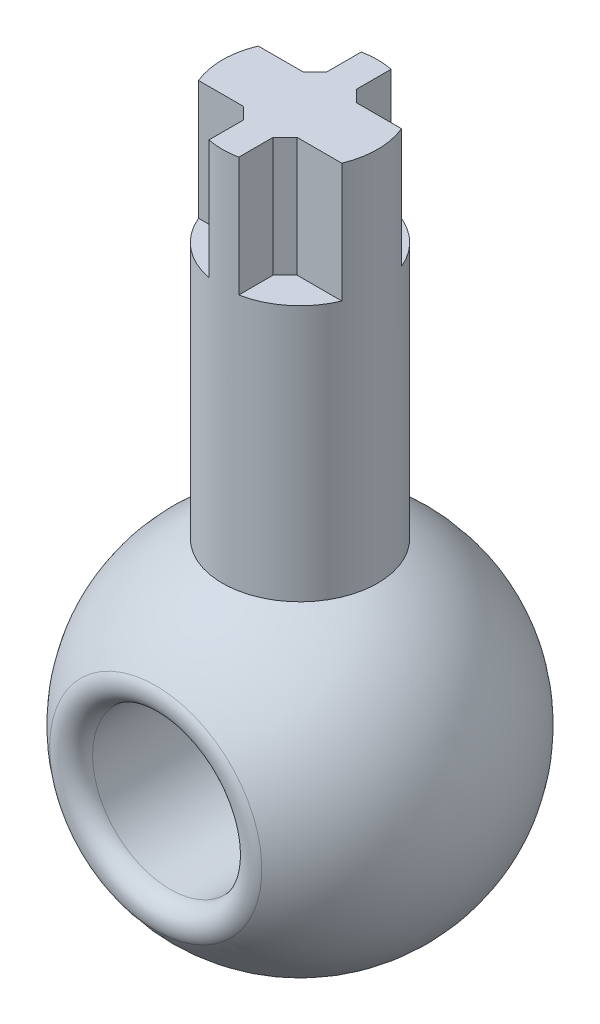
ISO-10303-21;
HEADER;
FILE_DESCRIPTION(('STEP AP214'),'2;1');
FILE_NAME('part.step','',(''),(''),'','','');
FILE_SCHEMA(('AUTOMOTIVE_DESIGN { 1 0 10303 214 1 1 1 1 }'));
ENDSEC;
DATA;
#1=APPLICATION_CONTEXT('core data for automotive mechanical design processes');
#2=APPLICATION_PROTOCOL_DEFINITION('international standard','automotive_design',2000,#1);
#3=PRODUCT_CONTEXT('',#1,'mechanical');
#4=PRODUCT('Part','Part','',(#3));
#5=PRODUCT_RELATED_PRODUCT_CATEGORY('part','',(#4));
#6=PRODUCT_DEFINITION_FORMATION('','',#4);
#7=PRODUCT_DEFINITION_CONTEXT('part definition',#1,'design');
#8=PRODUCT_DEFINITION('design','',#6,#7);
#9=PRODUCT_DEFINITION_SHAPE('','',#8);
#10=(LENGTH_UNIT() NAMED_UNIT(*) SI_UNIT(.MILLI.,.METRE.));
#11=(NAMED_UNIT(*) PLANE_ANGLE_UNIT() SI_UNIT($,.RADIAN.));
#12=(NAMED_UNIT(*) SI_UNIT($,.STERADIAN.) SOLID_ANGLE_UNIT());
#13=UNCERTAINTY_MEASURE_WITH_UNIT(LENGTH_MEASURE(1.E-05),#10,'distance_accuracy_value','');
#14=(GEOMETRIC_REPRESENTATION_CONTEXT(3) GLOBAL_UNCERTAINTY_ASSIGNED_CONTEXT((#13)) GLOBAL_UNIT_ASSIGNED_CONTEXT((#10,
#11,#12)) REPRESENTATION_CONTEXT('',''));
#15=CARTESIAN_POINT('',(0.,0.,0.));
#16=DIRECTION('',(0.,0.,1.));
#17=DIRECTION('',(1.,0.,0.));
#18=AXIS2_PLACEMENT_3D('',#15,#16,#17);
#19=CARTESIAN_POINT('',(0.,0.,0.));
#20=DIRECTION('',(-1.,0.,0.));
#21=DIRECTION('',(0.,1.,0.));
#22=AXIS2_PLACEMENT_3D('',#19,#20,#21);
#23=SPHERICAL_SURFACE('',#22,15.);
#24=CARTESIAN_POINT('',(0.,0.,12.082535094962));
#25=DIRECTION('',(0.,0.,-1.));
#26=DIRECTION('',(-1.,0.,0.));
#27=AXIS2_PLACEMENT_3D('',#24,#25,#26);
#28=CIRCLE('',#27,8.88888888888889);
#29=CARTESIAN_POINT('',(-8.88888888888889,0.,12.082535094962));
#30=VERTEX_POINT('',#29);
#31=EDGE_CURVE('E277',#30,#30,#28,.T.);
#32=ORIENTED_EDGE('',*,*,#31,.T.);
#33=EDGE_LOOP('',(#32));
#34=FACE_BOUND('',#33,.T.);
#35=CARTESIAN_POINT('',(0.,0.,-12.082535094962));
#36=DIRECTION('',(0.,0.,1.));
#37=DIRECTION('',(1.,0.,0.));
#38=AXIS2_PLACEMENT_3D('',#35,#36,#37);
#39=CIRCLE('',#38,8.88888888888889);
#40=CARTESIAN_POINT('',(8.88888888888889,0.,-12.082535094962));
#41=VERTEX_POINT('',#40);
#42=EDGE_CURVE('E274',#41,#41,#39,.T.);
#43=ORIENTED_EDGE('',*,*,#42,.T.);
#44=EDGE_LOOP('',(#43));
#45=FACE_BOUND('',#44,.T.);
#46=CARTESIAN_POINT('',(0.,13.5185058345958,0.));
#47=DIRECTION('',(0.,-1.,0.));
#48=DIRECTION('',(0.,0.,-1.));
#49=AXIS2_PLACEMENT_3D('',#46,#47,#48);
#50=CIRCLE('',#49,6.5);
#51=CARTESIAN_POINT('',(0.,13.5185058345958,-6.5));
#52=VERTEX_POINT('',#51);
#53=EDGE_CURVE('E236',#52,#52,#50,.F.);
#54=ORIENTED_EDGE('',*,*,#53,.F.);
#55=EDGE_LOOP('',(#54));
#56=FACE_BOUND('',#55,.T.);
#57=ADVANCED_FACE('F38',(#34,#45,#56),#23,.T.);
#58=CARTESIAN_POINT('',(0.,45.,0.));
#59=DIRECTION('',(0.,-1.,0.));
#60=DIRECTION('',(0.,0.,-1.));
#61=AXIS2_PLACEMENT_3D('',#58,#59,#60);
#62=CYLINDRICAL_SURFACE('',#61,6.5);
#63=CARTESIAN_POINT('',(0.,35.,0.));
#64=DIRECTION('',(0.,1.,0.));
#65=DIRECTION('',(0.,0.,1.));
#66=AXIS2_PLACEMENT_3D('',#63,#64,#65);
#67=CIRCLE('',#66,6.5);
#68=CARTESIAN_POINT('',(-6.,35.,2.5));
#69=VERTEX_POINT('',#68);
#70=CARTESIAN_POINT('',(-1.25,35.,6.37867541108654));
#71=VERTEX_POINT('',#70);
#72=EDGE_CURVE('E157',#69,#71,#67,.T.);
#73=ORIENTED_EDGE('',*,*,#72,.F.);
#74=DIRECTION('',(0.,1.,0.));
#75=VECTOR('',#74,1.);
#76=CARTESIAN_POINT('',(-6.,35.,2.5));
#77=LINE('',#76,#75);
#78=CARTESIAN_POINT('',(-6.,45.,2.5));
#79=VERTEX_POINT('',#78);
#80=EDGE_CURVE('E173',#69,#79,#77,.T.);
#81=ORIENTED_EDGE('',*,*,#80,.T.);
#82=CARTESIAN_POINT('',(0.,45.,0.));
#83=DIRECTION('',(0.,1.,0.));
#84=DIRECTION('',(0.,0.,1.));
#85=AXIS2_PLACEMENT_3D('',#82,#83,#84);
#86=CIRCLE('',#85,6.5);
#87=CARTESIAN_POINT('',(-6.,45.,-2.5));
#88=VERTEX_POINT('',#87);
#89=EDGE_CURVE('E233',#88,#79,#86,.T.);
#90=ORIENTED_EDGE('',*,*,#89,.F.);
#91=DIRECTION('',(0.,1.,0.));
#92=VECTOR('',#91,1.);
#93=CARTESIAN_POINT('',(-6.,35.,-2.5));
#94=LINE('',#93,#92);
#95=CARTESIAN_POINT('',(-6.,35.,-2.5));
#96=VERTEX_POINT('',#95);
#97=EDGE_CURVE('E224',#96,#88,#94,.T.);
#98=ORIENTED_EDGE('',*,*,#97,.F.);
#99=CARTESIAN_POINT('',(0.,35.,0.));
#100=DIRECTION('',(0.,1.,0.));
#101=DIRECTION('',(0.,0.,1.));
#102=AXIS2_PLACEMENT_3D('',#99,#100,#101);
#103=CIRCLE('',#102,6.5);
#104=CARTESIAN_POINT('',(-1.25,35.,-6.37867541108654));
#105=VERTEX_POINT('',#104);
#106=EDGE_CURVE('E215',#105,#96,#103,.T.);
#107=ORIENTED_EDGE('',*,*,#106,.F.);
#108=DIRECTION('',(0.,1.,0.));
#109=VECTOR('',#108,1.);
#110=CARTESIAN_POINT('',(-1.25,35.,-6.37867541108654));
#111=LINE('',#110,#109);
#112=CARTESIAN_POINT('',(-1.25,45.,-6.37867541108654));
#113=VERTEX_POINT('',#112);
#114=EDGE_CURVE('E228',#105,#113,#111,.T.);
#115=ORIENTED_EDGE('',*,*,#114,.T.);
#116=CARTESIAN_POINT('',(1.25,45.,-6.37867541108654));
#117=VERTEX_POINT('',#116);
#118=EDGE_CURVE('E231',#117,#113,#86,.T.);
#119=ORIENTED_EDGE('',*,*,#118,.F.);
#120=DIRECTION('',(0.,1.,0.));
#121=VECTOR('',#120,1.);
#122=CARTESIAN_POINT('',(1.25,35.,-6.37867541108654));
#123=LINE('',#122,#121);
#124=CARTESIAN_POINT('',(1.25,35.,-6.37867541108654));
#125=VERTEX_POINT('',#124);
#126=EDGE_CURVE('E189',#125,#117,#123,.T.);
#127=ORIENTED_EDGE('',*,*,#126,.F.);
#128=CARTESIAN_POINT('',(0.,35.,0.));
#129=DIRECTION('',(0.,1.,0.));
#130=DIRECTION('',(0.,0.,1.));
#131=AXIS2_PLACEMENT_3D('',#128,#129,#130);
#132=CIRCLE('',#131,6.5);
#133=CARTESIAN_POINT('',(6.,35.,-2.5));
#134=VERTEX_POINT('',#133);
#135=EDGE_CURVE('E180',#134,#125,#132,.T.);
#136=ORIENTED_EDGE('',*,*,#135,.F.);
#137=DIRECTION('',(0.,1.,0.));
#138=VECTOR('',#137,1.);
#139=CARTESIAN_POINT('',(6.,35.,-2.5));
#140=LINE('',#139,#138);
#141=CARTESIAN_POINT('',(6.,45.,-2.5));
#142=VERTEX_POINT('',#141);
#143=EDGE_CURVE('E193',#134,#142,#140,.T.);
#144=ORIENTED_EDGE('',*,*,#143,.T.);
#145=CARTESIAN_POINT('',(6.,45.,2.5));
#146=VERTEX_POINT('',#145);
#147=EDGE_CURVE('E237',#146,#142,#86,.T.);
#148=ORIENTED_EDGE('',*,*,#147,.F.);
#149=DIRECTION('',(0.,1.,0.));
#150=VECTOR('',#149,1.);
#151=CARTESIAN_POINT('',(6.,35.,2.5));
#152=LINE('',#151,#150);
#153=CARTESIAN_POINT('',(6.,35.,2.5));
#154=VERTEX_POINT('',#153);
#155=EDGE_CURVE('E207',#154,#146,#152,.T.);
#156=ORIENTED_EDGE('',*,*,#155,.F.);
#157=CARTESIAN_POINT('',(0.,35.,0.));
#158=DIRECTION('',(0.,1.,0.));
#159=DIRECTION('',(0.,0.,1.));
#160=AXIS2_PLACEMENT_3D('',#157,#158,#159);
#161=CIRCLE('',#160,6.5);
#162=CARTESIAN_POINT('',(1.25,35.,6.37867541108654));
#163=VERTEX_POINT('',#162);
#164=EDGE_CURVE('E198',#163,#154,#161,.T.);
#165=ORIENTED_EDGE('',*,*,#164,.F.);
#166=DIRECTION('',(0.,1.,0.));
#167=VECTOR('',#166,1.);
#168=CARTESIAN_POINT('',(1.25,35.,6.37867541108654));
#169=LINE('',#168,#167);
#170=CARTESIAN_POINT('',(1.25,45.,6.37867541108654));
#171=VERTEX_POINT('',#170);
#172=EDGE_CURVE('E211',#163,#171,#169,.T.);
#173=ORIENTED_EDGE('',*,*,#172,.T.);
#174=CARTESIAN_POINT('',(-1.25,45.,6.37867541108654));
#175=VERTEX_POINT('',#174);
#176=EDGE_CURVE('E172',#175,#171,#86,.T.);
#177=ORIENTED_EDGE('',*,*,#176,.F.);
#178=DIRECTION('',(0.,1.,0.));
#179=VECTOR('',#178,1.);
#180=CARTESIAN_POINT('',(-1.25,35.,6.37867541108654));
#181=LINE('',#180,#179);
#182=EDGE_CURVE('E153',#71,#175,#181,.T.);
#183=ORIENTED_EDGE('',*,*,#182,.F.);
#184=EDGE_LOOP('',(#73,#81,#90,#98,#107,#115,#119,#127,#136,#144,#148,#156,#165,#173,#177,#183));
#185=FACE_BOUND('',#184,.T.);
#186=ORIENTED_EDGE('',*,*,#53,.T.);
#187=EDGE_LOOP('',(#186));
#188=FACE_BOUND('',#187,.T.);
#189=ADVANCED_FACE('F168',(#185,#188),#62,.T.);
#190=CARTESIAN_POINT('',(0.,45.,0.));
#191=DIRECTION('',(0.,1.,0.));
#192=DIRECTION('',(0.,0.,1.));
#193=AXIS2_PLACEMENT_3D('',#190,#191,#192);
#194=PLANE('',#193);
#195=DIRECTION('',(-1.,0.,0.));
#196=VECTOR('',#195,1.);
#197=CARTESIAN_POINT('',(-1.25,45.,2.5));
#198=LINE('',#197,#196);
#199=CARTESIAN_POINT('',(-2.25000000000002,45.,2.5));
#200=VERTEX_POINT('',#199);
#201=EDGE_CURVE('E165',#200,#79,#198,.T.);
#202=ORIENTED_EDGE('',*,*,#201,.F.);
#203=DIRECTION('',(-0.707106781186551,0.,-0.707106781186544));
#204=VECTOR('',#203,1.);
#205=CARTESIAN_POINT('',(-2.25000000000002,45.,2.5));
#206=LINE('',#205,#204);
#207=CARTESIAN_POINT('',(-1.25,45.,3.50000000000001));
#208=VERTEX_POINT('',#207);
#209=EDGE_CURVE('E61',#200,#208,#206,.F.);
#210=ORIENTED_EDGE('',*,*,#209,.T.);
#211=DIRECTION('',(0.,0.,-1.));
#212=VECTOR('',#211,1.);
#213=CARTESIAN_POINT('',(-1.25,45.,2.5));
#214=LINE('',#213,#212);
#215=EDGE_CURVE('E387',#175,#208,#214,.T.);
#216=ORIENTED_EDGE('',*,*,#215,.F.);
#217=ORIENTED_EDGE('',*,*,#176,.T.);
#218=DIRECTION('',(0.,0.,1.));
#219=VECTOR('',#218,1.);
#220=CARTESIAN_POINT('',(1.25,45.,2.5));
#221=LINE('',#220,#219);
#222=CARTESIAN_POINT('',(1.25,45.,3.50000000000002));
#223=VERTEX_POINT('',#222);
#224=EDGE_CURVE('E202',#223,#171,#221,.T.);
#225=ORIENTED_EDGE('',*,*,#224,.F.);
#226=DIRECTION('',(-0.707106781186544,0.,0.707106781186551));
#227=VECTOR('',#226,1.);
#228=CARTESIAN_POINT('',(1.25,45.,3.50000000000002));
#229=LINE('',#228,#227);
#230=CARTESIAN_POINT('',(2.25000000000001,45.,2.5));
#231=VERTEX_POINT('',#230);
#232=EDGE_CURVE('E271',#223,#231,#229,.F.);
#233=ORIENTED_EDGE('',*,*,#232,.T.);
#234=DIRECTION('',(-1.,0.,0.));
#235=VECTOR('',#234,1.);
#236=CARTESIAN_POINT('',(6.,45.,2.5));
#237=LINE('',#236,#235);
#238=EDGE_CURVE('E196',#146,#231,#237,.T.);
#239=ORIENTED_EDGE('',*,*,#238,.F.);
#240=ORIENTED_EDGE('',*,*,#147,.T.);
#241=DIRECTION('',(1.,0.,0.));
#242=VECTOR('',#241,1.);
#243=CARTESIAN_POINT('',(6.,45.,-2.5));
#244=LINE('',#243,#242);
#245=CARTESIAN_POINT('',(2.25000000000002,45.,-2.5));
#246=VERTEX_POINT('',#245);
#247=EDGE_CURVE('E184',#246,#142,#244,.T.);
#248=ORIENTED_EDGE('',*,*,#247,.F.);
#249=DIRECTION('',(0.707106781186551,0.,0.707106781186544));
#250=VECTOR('',#249,1.);
#251=CARTESIAN_POINT('',(2.25000000000002,45.,-2.5));
#252=LINE('',#251,#250);
#253=CARTESIAN_POINT('',(1.25,45.,-3.50000000000001));
#254=VERTEX_POINT('',#253);
#255=EDGE_CURVE('E269',#246,#254,#252,.F.);
#256=ORIENTED_EDGE('',*,*,#255,.T.);
#257=DIRECTION('',(0.,0.,1.));
#258=VECTOR('',#257,1.);
#259=CARTESIAN_POINT('',(1.25,45.,-6.37867541108654));
#260=LINE('',#259,#258);
#261=EDGE_CURVE('E175',#117,#254,#260,.T.);
#262=ORIENTED_EDGE('',*,*,#261,.F.);
#263=ORIENTED_EDGE('',*,*,#118,.T.);
#264=DIRECTION('',(0.,0.,-1.));
#265=VECTOR('',#264,1.);
#266=CARTESIAN_POINT('',(-1.25,45.,-6.37867541108654));
#267=LINE('',#266,#265);
#268=CARTESIAN_POINT('',(-1.25,45.,-3.50000000000002));
#269=VERTEX_POINT('',#268);
#270=EDGE_CURVE('E219',#269,#113,#267,.T.);
#271=ORIENTED_EDGE('',*,*,#270,.F.);
#272=DIRECTION('',(0.707106781186544,0.,-0.707106781186551));
#273=VECTOR('',#272,1.);
#274=CARTESIAN_POINT('',(-1.25,45.,-3.50000000000002));
#275=LINE('',#274,#273);
#276=CARTESIAN_POINT('',(-2.25000000000001,45.,-2.5));
#277=VERTEX_POINT('',#276);
#278=EDGE_CURVE('E267',#269,#277,#275,.F.);
#279=ORIENTED_EDGE('',*,*,#278,.T.);
#280=DIRECTION('',(1.,0.,0.));
#281=VECTOR('',#280,1.);
#282=CARTESIAN_POINT('',(-1.25,45.,-2.5));
#283=LINE('',#282,#281);
#284=EDGE_CURVE('E213',#88,#277,#283,.T.);
#285=ORIENTED_EDGE('',*,*,#284,.F.);
#286=ORIENTED_EDGE('',*,*,#89,.T.);
#287=EDGE_LOOP('',(#202,#210,#216,#217,#225,#233,#239,#240,#248,#256,#262,#263,#271,#279,#285,#286));
#288=FACE_BOUND('',#287,.T.);
#289=ADVANCED_FACE('F295',(#288),#194,.T.);
#290=CARTESIAN_POINT('',(-1.25,35.,-6.37867541108654));
#291=DIRECTION('',(1.,0.,0.));
#292=DIRECTION('',(0.,0.,-1.));
#293=AXIS2_PLACEMENT_3D('',#290,#291,#292);
#294=PLANE('',#293);
#295=DIRECTION('',(0.,0.,-1.));
#296=VECTOR('',#295,1.);
#297=CARTESIAN_POINT('',(-1.25,35.,-6.37867541108654));
#298=LINE('',#297,#296);
#299=CARTESIAN_POINT('',(-1.25,35.,-3.50000000000002));
#300=VERTEX_POINT('',#299);
#301=EDGE_CURVE('E222',#300,#105,#298,.T.);
#302=ORIENTED_EDGE('',*,*,#301,.F.);
#303=DIRECTION('',(0.,1.,0.));
#304=VECTOR('',#303,1.);
#305=CARTESIAN_POINT('',(-1.25,45.,-3.50000000000002));
#306=LINE('',#305,#304);
#307=EDGE_CURVE('E240',#300,#269,#306,.T.);
#308=ORIENTED_EDGE('',*,*,#307,.T.);
#309=ORIENTED_EDGE('',*,*,#270,.T.);
#310=ORIENTED_EDGE('',*,*,#114,.F.);
#311=EDGE_LOOP('',(#302,#308,#309,#310));
#312=FACE_BOUND('',#311,.T.);
#313=ADVANCED_FACE('F300',(#312),#294,.F.);
#314=CARTESIAN_POINT('',(-1.25,35.,-2.5));
#315=DIRECTION('',(0.,0.,1.));
#316=DIRECTION('',(1.,0.,0.));
#317=AXIS2_PLACEMENT_3D('',#314,#315,#316);
#318=PLANE('',#317);
#319=ORIENTED_EDGE('',*,*,#284,.T.);
#320=DIRECTION('',(0.,-1.,0.));
#321=VECTOR('',#320,1.);
#322=CARTESIAN_POINT('',(-2.25000000000001,35.,-2.5));
#323=LINE('',#322,#321);
#324=CARTESIAN_POINT('',(-2.25000000000001,35.,-2.5));
#325=VERTEX_POINT('',#324);
#326=EDGE_CURVE('E243',#277,#325,#323,.T.);
#327=ORIENTED_EDGE('',*,*,#326,.T.);
#328=DIRECTION('',(1.,0.,0.));
#329=VECTOR('',#328,1.);
#330=CARTESIAN_POINT('',(-1.25,35.,-2.5));
#331=LINE('',#330,#329);
#332=EDGE_CURVE('E218',#96,#325,#331,.T.);
#333=ORIENTED_EDGE('',*,*,#332,.F.);
#334=ORIENTED_EDGE('',*,*,#97,.T.);
#335=EDGE_LOOP('',(#319,#327,#333,#334));
#336=FACE_BOUND('',#335,.T.);
#337=ADVANCED_FACE('F367',(#336),#318,.F.);
#338=CARTESIAN_POINT('',(0.,35.,0.));
#339=DIRECTION('',(0.,1.,0.));
#340=DIRECTION('',(0.,0.,1.));
#341=AXIS2_PLACEMENT_3D('',#338,#339,#340);
#342=PLANE('',#341);
#343=ORIENTED_EDGE('',*,*,#332,.T.);
#344=DIRECTION('',(-0.707106781186544,0.,0.707106781186551));
#345=VECTOR('',#344,1.);
#346=CARTESIAN_POINT('',(-2.37500000000002,35.,-2.37499999999999));
#347=LINE('',#346,#345);
#348=EDGE_CURVE('E245',#325,#300,#347,.F.);
#349=ORIENTED_EDGE('',*,*,#348,.T.);
#350=ORIENTED_EDGE('',*,*,#301,.T.);
#351=ORIENTED_EDGE('',*,*,#106,.T.);
#352=EDGE_LOOP('',(#343,#349,#350,#351));
#353=FACE_BOUND('',#352,.T.);
#354=ADVANCED_FACE('F360',(#353),#342,.T.);
#355=CARTESIAN_POINT('',(1.25,35.,2.5));
#356=DIRECTION('',(-1.,0.,0.));
#357=DIRECTION('',(0.,0.,1.));
#358=AXIS2_PLACEMENT_3D('',#355,#356,#357);
#359=PLANE('',#358);
#360=DIRECTION('',(0.,0.,1.));
#361=VECTOR('',#360,1.);
#362=CARTESIAN_POINT('',(1.25,35.,2.5));
#363=LINE('',#362,#361);
#364=CARTESIAN_POINT('',(1.25,35.,3.50000000000002));
#365=VERTEX_POINT('',#364);
#366=EDGE_CURVE('E205',#365,#163,#363,.T.);
#367=ORIENTED_EDGE('',*,*,#366,.F.);
#368=DIRECTION('',(0.,1.,0.));
#369=VECTOR('',#368,1.);
#370=CARTESIAN_POINT('',(1.25,45.,3.50000000000002));
#371=LINE('',#370,#369);
#372=EDGE_CURVE('E254',#365,#223,#371,.T.);
#373=ORIENTED_EDGE('',*,*,#372,.T.);
#374=ORIENTED_EDGE('',*,*,#224,.T.);
#375=ORIENTED_EDGE('',*,*,#172,.F.);
#376=EDGE_LOOP('',(#367,#373,#374,#375));
#377=FACE_BOUND('',#376,.T.);
#378=ADVANCED_FACE('F357',(#377),#359,.F.);
#379=CARTESIAN_POINT('',(6.,35.,2.5));
#380=DIRECTION('',(0.,0.,-1.));
#381=DIRECTION('',(-1.,0.,0.));
#382=AXIS2_PLACEMENT_3D('',#379,#380,#381);
#383=PLANE('',#382);
#384=ORIENTED_EDGE('',*,*,#238,.T.);
#385=DIRECTION('',(0.,-1.,0.));
#386=VECTOR('',#385,1.);
#387=CARTESIAN_POINT('',(2.25000000000001,35.,2.5));
#388=LINE('',#387,#386);
#389=CARTESIAN_POINT('',(2.25000000000001,35.,2.5));
#390=VERTEX_POINT('',#389);
#391=EDGE_CURVE('E257',#231,#390,#388,.T.);
#392=ORIENTED_EDGE('',*,*,#391,.T.);
#393=DIRECTION('',(-1.,0.,0.));
#394=VECTOR('',#393,1.);
#395=CARTESIAN_POINT('',(6.,35.,2.5));
#396=LINE('',#395,#394);
#397=EDGE_CURVE('E201',#154,#390,#396,.T.);
#398=ORIENTED_EDGE('',*,*,#397,.F.);
#399=ORIENTED_EDGE('',*,*,#155,.T.);
#400=EDGE_LOOP('',(#384,#392,#398,#399));
#401=FACE_BOUND('',#400,.T.);
#402=ADVANCED_FACE('F355',(#401),#383,.F.);
#403=CARTESIAN_POINT('',(0.,35.,0.));
#404=DIRECTION('',(0.,1.,0.));
#405=DIRECTION('',(0.,0.,1.));
#406=AXIS2_PLACEMENT_3D('',#403,#404,#405);
#407=PLANE('',#406);
#408=ORIENTED_EDGE('',*,*,#397,.T.);
#409=DIRECTION('',(0.707106781186544,0.,-0.707106781186551));
#410=VECTOR('',#409,1.);
#411=CARTESIAN_POINT('',(2.37500000000002,35.,2.37499999999999));
#412=LINE('',#411,#410);
#413=EDGE_CURVE('E259',#390,#365,#412,.F.);
#414=ORIENTED_EDGE('',*,*,#413,.T.);
#415=ORIENTED_EDGE('',*,*,#366,.T.);
#416=ORIENTED_EDGE('',*,*,#164,.T.);
#417=EDGE_LOOP('',(#408,#414,#415,#416));
#418=FACE_BOUND('',#417,.T.);
#419=ADVANCED_FACE('F348',(#418),#407,.T.);
#420=CARTESIAN_POINT('',(6.,35.,-2.5));
#421=DIRECTION('',(0.,0.,1.));
#422=DIRECTION('',(1.,0.,0.));
#423=AXIS2_PLACEMENT_3D('',#420,#421,#422);
#424=PLANE('',#423);
#425=DIRECTION('',(1.,0.,0.));
#426=VECTOR('',#425,1.);
#427=CARTESIAN_POINT('',(6.,35.,-2.5));
#428=LINE('',#427,#426);
#429=CARTESIAN_POINT('',(2.25000000000002,35.,-2.5));
#430=VERTEX_POINT('',#429);
#431=EDGE_CURVE('E187',#430,#134,#428,.T.);
#432=ORIENTED_EDGE('',*,*,#431,.F.);
#433=DIRECTION('',(0.,1.,0.));
#434=VECTOR('',#433,1.);
#435=CARTESIAN_POINT('',(2.25000000000002,45.,-2.5));
#436=LINE('',#435,#434);
#437=EDGE_CURVE('E247',#430,#246,#436,.T.);
#438=ORIENTED_EDGE('',*,*,#437,.T.);
#439=ORIENTED_EDGE('',*,*,#247,.T.);
#440=ORIENTED_EDGE('',*,*,#143,.F.);
#441=EDGE_LOOP('',(#432,#438,#439,#440));
#442=FACE_BOUND('',#441,.T.);
#443=ADVANCED_FACE('F345',(#442),#424,.F.);
#444=CARTESIAN_POINT('',(1.25,35.,-6.37867541108654));
#445=DIRECTION('',(-1.,0.,0.));
#446=DIRECTION('',(0.,0.,1.));
#447=AXIS2_PLACEMENT_3D('',#444,#445,#446);
#448=PLANE('',#447);
#449=ORIENTED_EDGE('',*,*,#261,.T.);
#450=DIRECTION('',(0.,-1.,0.));
#451=VECTOR('',#450,1.);
#452=CARTESIAN_POINT('',(1.25,35.,-3.50000000000001));
#453=LINE('',#452,#451);
#454=CARTESIAN_POINT('',(1.25,35.,-3.50000000000001));
#455=VERTEX_POINT('',#454);
#456=EDGE_CURVE('E250',#254,#455,#453,.T.);
#457=ORIENTED_EDGE('',*,*,#456,.T.);
#458=DIRECTION('',(0.,0.,1.));
#459=VECTOR('',#458,1.);
#460=CARTESIAN_POINT('',(1.25,35.,-6.37867541108654));
#461=LINE('',#460,#459);
#462=EDGE_CURVE('E183',#125,#455,#461,.T.);
#463=ORIENTED_EDGE('',*,*,#462,.F.);
#464=ORIENTED_EDGE('',*,*,#126,.T.);
#465=EDGE_LOOP('',(#449,#457,#463,#464));
#466=FACE_BOUND('',#465,.T.);
#467=ADVANCED_FACE('F343',(#466),#448,.F.);
#468=CARTESIAN_POINT('',(0.,35.,0.));
#469=DIRECTION('',(0.,1.,0.));
#470=DIRECTION('',(0.,0.,1.));
#471=AXIS2_PLACEMENT_3D('',#468,#469,#470);
#472=PLANE('',#471);
#473=ORIENTED_EDGE('',*,*,#462,.T.);
#474=DIRECTION('',(-0.707106781186551,0.,-0.707106781186544));
#475=VECTOR('',#474,1.);
#476=CARTESIAN_POINT('',(2.375,35.,-2.37500000000002));
#477=LINE('',#476,#475);
#478=EDGE_CURVE('E252',#455,#430,#477,.F.);
#479=ORIENTED_EDGE('',*,*,#478,.T.);
#480=ORIENTED_EDGE('',*,*,#431,.T.);
#481=ORIENTED_EDGE('',*,*,#135,.T.);
#482=EDGE_LOOP('',(#473,#479,#480,#481));
#483=FACE_BOUND('',#482,.T.);
#484=ADVANCED_FACE('F337',(#483),#472,.T.);
#485=CARTESIAN_POINT('',(-1.25,35.,2.5));
#486=DIRECTION('',(0.,0.,-1.));
#487=DIRECTION('',(-1.,0.,0.));
#488=AXIS2_PLACEMENT_3D('',#485,#486,#487);
#489=PLANE('',#488);
#490=DIRECTION('',(-1.,0.,0.));
#491=VECTOR('',#490,1.);
#492=CARTESIAN_POINT('',(-1.25,35.,2.5));
#493=LINE('',#492,#491);
#494=CARTESIAN_POINT('',(-2.25000000000002,35.,2.5));
#495=VERTEX_POINT('',#494);
#496=EDGE_CURVE('E156',#495,#69,#493,.T.);
#497=ORIENTED_EDGE('',*,*,#496,.F.);
#498=DIRECTION('',(0.,1.,0.));
#499=VECTOR('',#498,1.);
#500=CARTESIAN_POINT('',(-2.25000000000002,45.,2.5));
#501=LINE('',#500,#499);
#502=EDGE_CURVE('E261',#495,#200,#501,.T.);
#503=ORIENTED_EDGE('',*,*,#502,.T.);
#504=ORIENTED_EDGE('',*,*,#201,.T.);
#505=ORIENTED_EDGE('',*,*,#80,.F.);
#506=EDGE_LOOP('',(#497,#503,#504,#505));
#507=FACE_BOUND('',#506,.T.);
#508=ADVANCED_FACE('F334',(#507),#489,.F.);
#509=CARTESIAN_POINT('',(-1.25,35.,2.5));
#510=DIRECTION('',(1.,0.,0.));
#511=DIRECTION('',(0.,0.,-1.));
#512=AXIS2_PLACEMENT_3D('',#509,#510,#511);
#513=PLANE('',#512);
#514=ORIENTED_EDGE('',*,*,#215,.T.);
#515=DIRECTION('',(0.,-1.,0.));
#516=VECTOR('',#515,1.);
#517=CARTESIAN_POINT('',(-1.25,35.,3.50000000000001));
#518=LINE('',#517,#516);
#519=CARTESIAN_POINT('',(-1.25,35.,3.50000000000001));
#520=VERTEX_POINT('',#519);
#521=EDGE_CURVE('E53',#208,#520,#518,.T.);
#522=ORIENTED_EDGE('',*,*,#521,.T.);
#523=DIRECTION('',(0.,0.,-1.));
#524=VECTOR('',#523,1.);
#525=CARTESIAN_POINT('',(-1.25,35.,2.5));
#526=LINE('',#525,#524);
#527=EDGE_CURVE('E149',#71,#520,#526,.T.);
#528=ORIENTED_EDGE('',*,*,#527,.F.);
#529=ORIENTED_EDGE('',*,*,#182,.T.);
#530=EDGE_LOOP('',(#514,#522,#528,#529));
#531=FACE_BOUND('',#530,.T.);
#532=ADVANCED_FACE('F151',(#531),#513,.F.);
#533=CARTESIAN_POINT('',(0.,35.,0.));
#534=DIRECTION('',(0.,1.,0.));
#535=DIRECTION('',(0.,0.,1.));
#536=AXIS2_PLACEMENT_3D('',#533,#534,#535);
#537=PLANE('',#536);
#538=ORIENTED_EDGE('',*,*,#527,.T.);
#539=DIRECTION('',(0.707106781186551,0.,0.707106781186544));
#540=VECTOR('',#539,1.);
#541=CARTESIAN_POINT('',(-2.375,35.,2.37500000000002));
#542=LINE('',#541,#540);
#543=EDGE_CURVE('E265',#520,#495,#542,.F.);
#544=ORIENTED_EDGE('',*,*,#543,.T.);
#545=ORIENTED_EDGE('',*,*,#496,.T.);
#546=ORIENTED_EDGE('',*,*,#72,.T.);
#547=EDGE_LOOP('',(#538,#544,#545,#546));
#548=FACE_BOUND('',#547,.T.);
#549=ADVANCED_FACE('F160',(#548),#537,.T.);
#550=CARTESIAN_POINT('',(-1.25,35.,-3.50000000000002));
#551=DIRECTION('',(-0.707106781186551,0.,-0.707106781186544));
#552=DIRECTION('',(-0.707106781186544,0.,0.707106781186551));
#553=AXIS2_PLACEMENT_3D('',#550,#551,#552);
#554=PLANE('',#553);
#555=ORIENTED_EDGE('',*,*,#348,.F.);
#556=ORIENTED_EDGE('',*,*,#326,.F.);
#557=ORIENTED_EDGE('',*,*,#278,.F.);
#558=ORIENTED_EDGE('',*,*,#307,.F.);
#559=EDGE_LOOP('',(#555,#556,#557,#558));
#560=FACE_BOUND('',#559,.T.);
#561=ADVANCED_FACE('F304',(#560),#554,.T.);
#562=CARTESIAN_POINT('',(2.25000000000002,35.,-2.5));
#563=DIRECTION('',(0.707106781186544,0.,-0.707106781186551));
#564=DIRECTION('',(-0.707106781186551,0.,-0.707106781186544));
#565=AXIS2_PLACEMENT_3D('',#562,#563,#564);
#566=PLANE('',#565);
#567=ORIENTED_EDGE('',*,*,#478,.F.);
#568=ORIENTED_EDGE('',*,*,#456,.F.);
#569=ORIENTED_EDGE('',*,*,#255,.F.);
#570=ORIENTED_EDGE('',*,*,#437,.F.);
#571=EDGE_LOOP('',(#567,#568,#569,#570));
#572=FACE_BOUND('',#571,.T.);
#573=ADVANCED_FACE('F307',(#572),#566,.T.);
#574=CARTESIAN_POINT('',(1.25,35.,3.50000000000002));
#575=DIRECTION('',(0.707106781186551,0.,0.707106781186544));
#576=DIRECTION('',(0.707106781186544,0.,-0.707106781186551));
#577=AXIS2_PLACEMENT_3D('',#574,#575,#576);
#578=PLANE('',#577);
#579=ORIENTED_EDGE('',*,*,#413,.F.);
#580=ORIENTED_EDGE('',*,*,#391,.F.);
#581=ORIENTED_EDGE('',*,*,#232,.F.);
#582=ORIENTED_EDGE('',*,*,#372,.F.);
#583=EDGE_LOOP('',(#579,#580,#581,#582));
#584=FACE_BOUND('',#583,.T.);
#585=ADVANCED_FACE('F311',(#584),#578,.T.);
#586=CARTESIAN_POINT('',(-2.25000000000002,35.,2.5));
#587=DIRECTION('',(-0.707106781186544,0.,0.707106781186551));
#588=DIRECTION('',(0.707106781186551,0.,0.707106781186544));
#589=AXIS2_PLACEMENT_3D('',#586,#587,#588);
#590=PLANE('',#589);
#591=ORIENTED_EDGE('',*,*,#543,.F.);
#592=ORIENTED_EDGE('',*,*,#521,.F.);
#593=ORIENTED_EDGE('',*,*,#209,.F.);
#594=ORIENTED_EDGE('',*,*,#502,.F.);
#595=EDGE_LOOP('',(#591,#592,#593,#594));
#596=FACE_BOUND('',#595,.T.);
#597=ADVANCED_FACE('F315',(#596),#590,.T.);
#598=CARTESIAN_POINT('',(0.,0.,-15.));
#599=DIRECTION('',(0.,0.,1.));
#600=DIRECTION('',(1.,0.,0.));
#601=AXIS2_PLACEMENT_3D('',#598,#599,#600);
#602=CYLINDRICAL_SURFACE('',#601,6.5);
#603=CARTESIAN_POINT('',(0.,0.,10.8742815854658));
#604=DIRECTION('',(0.,0.,-1.));
#605=DIRECTION('',(-1.,0.,0.));
#606=AXIS2_PLACEMENT_3D('',#603,#604,#605);
#607=CIRCLE('',#606,6.5);
#608=CARTESIAN_POINT('',(-6.5,0.,10.8742815854658));
#609=VERTEX_POINT('',#608);
#610=EDGE_CURVE('E11',#609,#609,#607,.F.);
#611=ORIENTED_EDGE('',*,*,#610,.T.);
#612=EDGE_LOOP('',(#611));
#613=FACE_BOUND('',#612,.T.);
#614=CARTESIAN_POINT('',(0.,0.,-10.8742815854658));
#615=DIRECTION('',(0.,0.,1.));
#616=DIRECTION('',(1.,0.,0.));
#617=AXIS2_PLACEMENT_3D('',#614,#615,#616);
#618=CIRCLE('',#617,6.5);
#619=CARTESIAN_POINT('',(6.5,0.,-10.8742815854658));
#620=VERTEX_POINT('',#619);
#621=EDGE_CURVE('E46',#620,#620,#618,.F.);
#622=ORIENTED_EDGE('',*,*,#621,.T.);
#623=EDGE_LOOP('',(#622));
#624=FACE_BOUND('',#623,.T.);
#625=ADVANCED_FACE('F282',(#613,#624),#602,.F.);
#626=CARTESIAN_POINT('',(0.,0.,10.8742815854658));
#627=DIRECTION('',(0.,0.,-1.));
#628=DIRECTION('',(-1.,0.,0.));
#629=AXIS2_PLACEMENT_3D('',#626,#627,#628);
#630=TOROIDAL_SURFACE('',#629,8.,1.5);
#631=ORIENTED_EDGE('',*,*,#610,.F.);
#632=EDGE_LOOP('',(#631));
#633=FACE_BOUND('',#632,.T.);
#634=ORIENTED_EDGE('',*,*,#31,.F.);
#635=EDGE_LOOP('',(#634));
#636=FACE_BOUND('',#635,.T.);
#637=ADVANCED_FACE('F286',(#633,#636),#630,.T.);
#638=CARTESIAN_POINT('',(0.,0.,-10.8742815854658));
#639=DIRECTION('',(0.,0.,1.));
#640=DIRECTION('',(1.,0.,0.));
#641=AXIS2_PLACEMENT_3D('',#638,#639,#640);
#642=TOROIDAL_SURFACE('',#641,8.,1.5);
#643=ORIENTED_EDGE('',*,*,#621,.F.);
#644=EDGE_LOOP('',(#643));
#645=FACE_BOUND('',#644,.T.);
#646=ORIENTED_EDGE('',*,*,#42,.F.);
#647=EDGE_LOOP('',(#646));
#648=FACE_BOUND('',#647,.T.);
#649=ADVANCED_FACE('F40',(#645,#648),#642,.T.);
#650=CLOSED_SHELL('',(#57,#189,#289,#313,#337,#354,#378,#402,#419,#443,#467,#484,#508,#532,#549,
#561,#573,#585,#597,#625,#637,#649));
#651=MANIFOLD_SOLID_BREP('B2',#650);
#652=ADVANCED_BREP_SHAPE_REPRESENTATION('',(#18,#651),#14);
#653=SHAPE_DEFINITION_REPRESENTATION(#9,#652);
ENDSEC;
END-ISO-10303-21;
